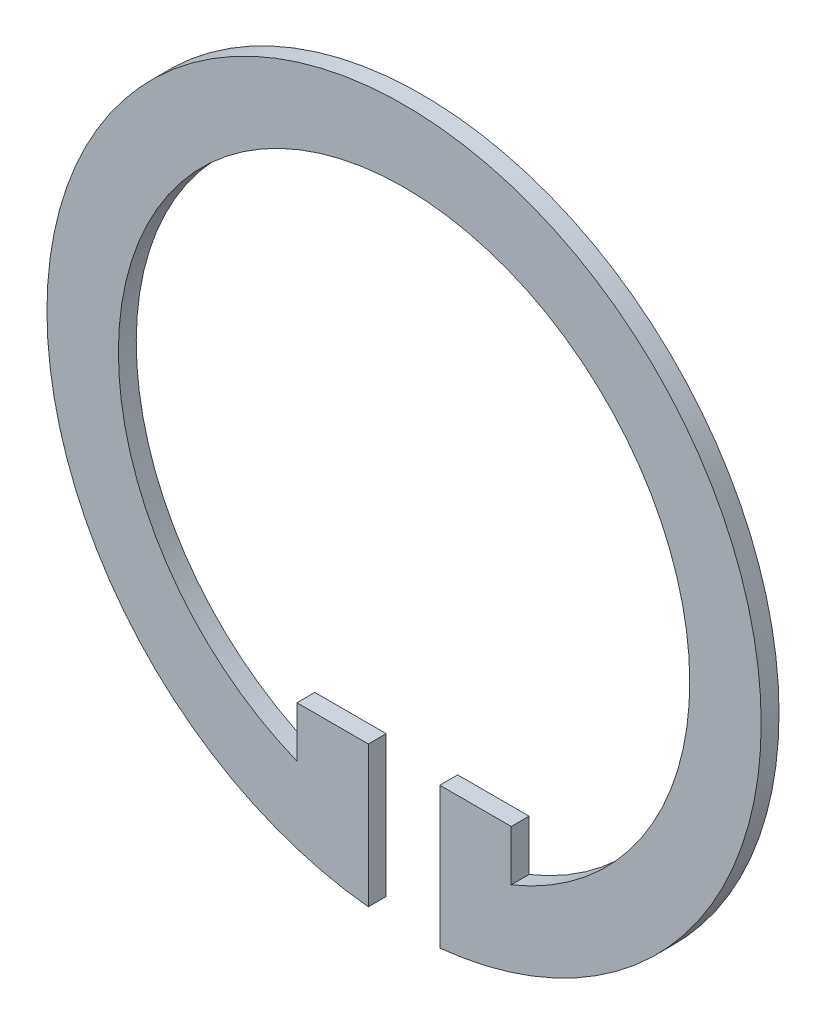
ISO-10303-21;
HEADER;
FILE_DESCRIPTION(('STEP AP214'),'2;1');
FILE_NAME('part.step','',(''),(''),'','','');
FILE_SCHEMA(('AUTOMOTIVE_DESIGN { 1 0 10303 214 1 1 1 1 }'));
ENDSEC;
DATA;
#1=APPLICATION_CONTEXT('core data for automotive mechanical design processes');
#2=APPLICATION_PROTOCOL_DEFINITION('international standard','automotive_design',2000,#1);
#3=PRODUCT_CONTEXT('',#1,'mechanical');
#4=PRODUCT('Part','Part','',(#3));
#5=PRODUCT_RELATED_PRODUCT_CATEGORY('part','',(#4));
#6=PRODUCT_DEFINITION_FORMATION('','',#4);
#7=PRODUCT_DEFINITION_CONTEXT('part definition',#1,'design');
#8=PRODUCT_DEFINITION('design','',#6,#7);
#9=PRODUCT_DEFINITION_SHAPE('','',#8);
#10=(LENGTH_UNIT() NAMED_UNIT(*) SI_UNIT(.MILLI.,.METRE.));
#11=(NAMED_UNIT(*) PLANE_ANGLE_UNIT() SI_UNIT($,.RADIAN.));
#12=(NAMED_UNIT(*) SI_UNIT($,.STERADIAN.) SOLID_ANGLE_UNIT());
#13=UNCERTAINTY_MEASURE_WITH_UNIT(LENGTH_MEASURE(1.E-05),#10,'distance_accuracy_value','');
#14=(GEOMETRIC_REPRESENTATION_CONTEXT(3) GLOBAL_UNCERTAINTY_ASSIGNED_CONTEXT((#13)) GLOBAL_UNIT_ASSIGNED_CONTEXT((#10,
#11,#12)) REPRESENTATION_CONTEXT('',''));
#15=CARTESIAN_POINT('',(0.,0.,0.));
#16=DIRECTION('',(0.,0.,1.));
#17=DIRECTION('',(1.,0.,0.));
#18=AXIS2_PLACEMENT_3D('',#15,#16,#17);
#19=CARTESIAN_POINT('',(-3.,-6.,0.5));
#20=DIRECTION('',(1.,0.,0.));
#21=DIRECTION('',(0.,0.,-1.));
#22=AXIS2_PLACEMENT_3D('',#19,#20,#21);
#23=PLANE('',#22);
#24=DIRECTION('',(0.,-1.,0.));
#25=VECTOR('',#24,1.);
#26=CARTESIAN_POINT('',(-3.,-6.,0.));
#27=LINE('',#26,#25);
#28=CARTESIAN_POINT('',(-3.,-6.,0.));
#29=VERTEX_POINT('',#28);
#30=CARTESIAN_POINT('',(-3.,-7.41619848709566,0.));
#31=VERTEX_POINT('',#30);
#32=EDGE_CURVE('E146',#29,#31,#27,.T.);
#33=ORIENTED_EDGE('',*,*,#32,.T.);
#34=DIRECTION('',(0.,0.,-1.));
#35=VECTOR('',#34,1.);
#36=CARTESIAN_POINT('',(-3.,-7.41619848709566,0.5));
#37=LINE('',#36,#35);
#38=CARTESIAN_POINT('',(-3.,-7.41619848709566,0.5));
#39=VERTEX_POINT('',#38);
#40=EDGE_CURVE('E11',#39,#31,#37,.T.);
#41=ORIENTED_EDGE('',*,*,#40,.F.);
#42=DIRECTION('',(0.,-1.,0.));
#43=VECTOR('',#42,1.);
#44=CARTESIAN_POINT('',(-3.,-6.,0.5));
#45=LINE('',#44,#43);
#46=CARTESIAN_POINT('',(-3.,-6.,0.5));
#47=VERTEX_POINT('',#46);
#48=EDGE_CURVE('E168',#47,#39,#45,.T.);
#49=ORIENTED_EDGE('',*,*,#48,.F.);
#50=DIRECTION('',(0.,0.,-1.));
#51=VECTOR('',#50,1.);
#52=CARTESIAN_POINT('',(-3.,-6.,0.5));
#53=LINE('',#52,#51);
#54=EDGE_CURVE('E142',#47,#29,#53,.T.);
#55=ORIENTED_EDGE('',*,*,#54,.T.);
#56=EDGE_LOOP('',(#33,#41,#49,#55));
#57=FACE_BOUND('',#56,.T.);
#58=ADVANCED_FACE('F45',(#57),#23,.F.);
#59=CARTESIAN_POINT('',(0.,0.,0.5));
#60=DIRECTION('',(0.,0.,-1.));
#61=DIRECTION('',(-1.,0.,0.));
#62=AXIS2_PLACEMENT_3D('',#59,#60,#61);
#63=CYLINDRICAL_SURFACE('',#62,8.);
#64=CARTESIAN_POINT('',(0.,0.,0.));
#65=DIRECTION('',(0.,0.,-1.));
#66=DIRECTION('',(-1.,0.,0.));
#67=AXIS2_PLACEMENT_3D('',#64,#65,#66);
#68=CIRCLE('',#67,8.);
#69=CARTESIAN_POINT('',(3.,-7.41619848709566,0.));
#70=VERTEX_POINT('',#69);
#71=EDGE_CURVE('E150',#31,#70,#68,.T.);
#72=ORIENTED_EDGE('',*,*,#71,.T.);
#73=DIRECTION('',(0.,0.,-1.));
#74=VECTOR('',#73,1.);
#75=CARTESIAN_POINT('',(3.,-7.41619848709566,0.5));
#76=LINE('',#75,#74);
#77=CARTESIAN_POINT('',(3.,-7.41619848709566,0.5));
#78=VERTEX_POINT('',#77);
#79=EDGE_CURVE('E54',#78,#70,#76,.T.);
#80=ORIENTED_EDGE('',*,*,#79,.F.);
#81=CARTESIAN_POINT('',(0.,0.,0.5));
#82=DIRECTION('',(0.,0.,-1.));
#83=DIRECTION('',(-1.,0.,0.));
#84=AXIS2_PLACEMENT_3D('',#81,#82,#83);
#85=CIRCLE('',#84,8.);
#86=EDGE_CURVE('E105',#39,#78,#85,.T.);
#87=ORIENTED_EDGE('',*,*,#86,.F.);
#88=ORIENTED_EDGE('',*,*,#40,.T.);
#89=EDGE_LOOP('',(#72,#80,#87,#88));
#90=FACE_BOUND('',#89,.T.);
#91=ADVANCED_FACE('F214',(#90),#63,.F.);
#92=CARTESIAN_POINT('',(3.,-6.,0.5));
#93=DIRECTION('',(-1.,0.,0.));
#94=DIRECTION('',(0.,0.,1.));
#95=AXIS2_PLACEMENT_3D('',#92,#93,#94);
#96=PLANE('',#95);
#97=DIRECTION('',(0.,1.,0.));
#98=VECTOR('',#97,1.);
#99=CARTESIAN_POINT('',(3.,-6.,0.));
#100=LINE('',#99,#98);
#101=CARTESIAN_POINT('',(3.,-6.,0.));
#102=VERTEX_POINT('',#101);
#103=EDGE_CURVE('E153',#70,#102,#100,.T.);
#104=ORIENTED_EDGE('',*,*,#103,.T.);
#105=DIRECTION('',(0.,0.,-1.));
#106=VECTOR('',#105,1.);
#107=CARTESIAN_POINT('',(3.,-6.,0.5));
#108=LINE('',#107,#106);
#109=CARTESIAN_POINT('',(3.,-6.,0.5));
#110=VERTEX_POINT('',#109);
#111=EDGE_CURVE('E179',#110,#102,#108,.T.);
#112=ORIENTED_EDGE('',*,*,#111,.F.);
#113=DIRECTION('',(0.,1.,0.));
#114=VECTOR('',#113,1.);
#115=CARTESIAN_POINT('',(3.,-6.,0.5));
#116=LINE('',#115,#114);
#117=EDGE_CURVE('E189',#78,#110,#116,.T.);
#118=ORIENTED_EDGE('',*,*,#117,.F.);
#119=ORIENTED_EDGE('',*,*,#79,.T.);
#120=EDGE_LOOP('',(#104,#112,#118,#119));
#121=FACE_BOUND('',#120,.T.);
#122=ADVANCED_FACE('F187',(#121),#96,.F.);
#123=CARTESIAN_POINT('',(1.,-6.,0.5));
#124=DIRECTION('',(0.,-1.,0.));
#125=DIRECTION('',(1.,0.,0.));
#126=AXIS2_PLACEMENT_3D('',#123,#124,#125);
#127=PLANE('',#126);
#128=DIRECTION('',(-1.,0.,0.));
#129=VECTOR('',#128,1.);
#130=CARTESIAN_POINT('',(1.,-6.,0.));
#131=LINE('',#130,#129);
#132=CARTESIAN_POINT('',(1.,-6.,0.));
#133=VERTEX_POINT('',#132);
#134=EDGE_CURVE('E156',#102,#133,#131,.T.);
#135=ORIENTED_EDGE('',*,*,#134,.T.);
#136=DIRECTION('',(0.,0.,-1.));
#137=VECTOR('',#136,1.);
#138=CARTESIAN_POINT('',(1.,-6.,0.5));
#139=LINE('',#138,#137);
#140=CARTESIAN_POINT('',(1.,-6.,0.5));
#141=VERTEX_POINT('',#140);
#142=EDGE_CURVE('E175',#141,#133,#139,.T.);
#143=ORIENTED_EDGE('',*,*,#142,.F.);
#144=DIRECTION('',(-1.,0.,0.));
#145=VECTOR('',#144,1.);
#146=CARTESIAN_POINT('',(1.,-6.,0.5));
#147=LINE('',#146,#145);
#148=EDGE_CURVE('E202',#110,#141,#147,.T.);
#149=ORIENTED_EDGE('',*,*,#148,.F.);
#150=ORIENTED_EDGE('',*,*,#111,.T.);
#151=EDGE_LOOP('',(#135,#143,#149,#150));
#152=FACE_BOUND('',#151,.T.);
#153=ADVANCED_FACE('F197',(#152),#127,.F.);
#154=CARTESIAN_POINT('',(1.,-6.,0.5));
#155=DIRECTION('',(1.,0.,0.));
#156=DIRECTION('',(0.,1.,0.));
#157=AXIS2_PLACEMENT_3D('',#154,#155,#156);
#158=PLANE('',#157);
#159=DIRECTION('',(0.,-1.,0.));
#160=VECTOR('',#159,1.);
#161=CARTESIAN_POINT('',(1.,-6.,0.));
#162=LINE('',#161,#160);
#163=CARTESIAN_POINT('',(1.,-9.9498743710662,0.));
#164=VERTEX_POINT('',#163);
#165=EDGE_CURVE('E159',#133,#164,#162,.T.);
#166=ORIENTED_EDGE('',*,*,#165,.T.);
#167=DIRECTION('',(0.,0.,-1.));
#168=VECTOR('',#167,1.);
#169=CARTESIAN_POINT('',(1.,-9.9498743710662,0.5));
#170=LINE('',#169,#168);
#171=CARTESIAN_POINT('',(1.,-9.9498743710662,0.5));
#172=VERTEX_POINT('',#171);
#173=EDGE_CURVE('E135',#172,#164,#170,.T.);
#174=ORIENTED_EDGE('',*,*,#173,.F.);
#175=DIRECTION('',(0.,-1.,0.));
#176=VECTOR('',#175,1.);
#177=CARTESIAN_POINT('',(1.,-6.,0.5));
#178=LINE('',#177,#176);
#179=EDGE_CURVE('E124',#141,#172,#178,.T.);
#180=ORIENTED_EDGE('',*,*,#179,.F.);
#181=ORIENTED_EDGE('',*,*,#142,.T.);
#182=EDGE_LOOP('',(#166,#174,#180,#181));
#183=FACE_BOUND('',#182,.T.);
#184=ADVANCED_FACE('F200',(#183),#158,.F.);
#185=CARTESIAN_POINT('',(0.,0.,0.5));
#186=DIRECTION('',(0.,0.,-1.));
#187=DIRECTION('',(-1.,0.,0.));
#188=AXIS2_PLACEMENT_3D('',#185,#186,#187);
#189=CYLINDRICAL_SURFACE('',#188,10.);
#190=CARTESIAN_POINT('',(0.,0.,0.));
#191=DIRECTION('',(0.,0.,1.));
#192=DIRECTION('',(-1.,0.,0.));
#193=AXIS2_PLACEMENT_3D('',#190,#191,#192);
#194=CIRCLE('',#193,10.);
#195=CARTESIAN_POINT('',(-0.999999999999999,-9.9498743710662,0.));
#196=VERTEX_POINT('',#195);
#197=EDGE_CURVE('E133',#164,#196,#194,.T.);
#198=ORIENTED_EDGE('',*,*,#197,.T.);
#199=DIRECTION('',(0.,0.,-1.));
#200=VECTOR('',#199,1.);
#201=CARTESIAN_POINT('',(-0.999999999999999,-9.9498743710662,0.5));
#202=LINE('',#201,#200);
#203=CARTESIAN_POINT('',(-0.999999999999999,-9.9498743710662,0.5));
#204=VERTEX_POINT('',#203);
#205=EDGE_CURVE('E130',#204,#196,#202,.T.);
#206=ORIENTED_EDGE('',*,*,#205,.F.);
#207=CARTESIAN_POINT('',(0.,0.,0.5));
#208=DIRECTION('',(0.,0.,1.));
#209=DIRECTION('',(-1.,0.,0.));
#210=AXIS2_PLACEMENT_3D('',#207,#208,#209);
#211=CIRCLE('',#210,10.);
#212=EDGE_CURVE('E118',#172,#204,#211,.T.);
#213=ORIENTED_EDGE('',*,*,#212,.F.);
#214=ORIENTED_EDGE('',*,*,#173,.T.);
#215=EDGE_LOOP('',(#198,#206,#213,#214));
#216=FACE_BOUND('',#215,.T.);
#217=ADVANCED_FACE('F131',(#216),#189,.T.);
#218=CARTESIAN_POINT('',(-0.999999999999999,-6.,0.5));
#219=DIRECTION('',(-1.,0.,0.));
#220=DIRECTION('',(0.,0.,1.));
#221=AXIS2_PLACEMENT_3D('',#218,#219,#220);
#222=PLANE('',#221);
#223=DIRECTION('',(0.,1.,0.));
#224=VECTOR('',#223,1.);
#225=CARTESIAN_POINT('',(-0.999999999999999,-6.,0.));
#226=LINE('',#225,#224);
#227=CARTESIAN_POINT('',(-0.999999999999999,-6.,0.));
#228=VERTEX_POINT('',#227);
#229=EDGE_CURVE('E91',#196,#228,#226,.T.);
#230=ORIENTED_EDGE('',*,*,#229,.T.);
#231=DIRECTION('',(0.,0.,-1.));
#232=VECTOR('',#231,1.);
#233=CARTESIAN_POINT('',(-0.999999999999999,-6.,0.5));
#234=LINE('',#233,#232);
#235=CARTESIAN_POINT('',(-0.999999999999999,-6.,0.5));
#236=VERTEX_POINT('',#235);
#237=EDGE_CURVE('E136',#236,#228,#234,.T.);
#238=ORIENTED_EDGE('',*,*,#237,.F.);
#239=DIRECTION('',(0.,1.,0.));
#240=VECTOR('',#239,1.);
#241=CARTESIAN_POINT('',(-0.999999999999999,-6.,0.5));
#242=LINE('',#241,#240);
#243=EDGE_CURVE('E122',#204,#236,#242,.T.);
#244=ORIENTED_EDGE('',*,*,#243,.F.);
#245=ORIENTED_EDGE('',*,*,#205,.T.);
#246=EDGE_LOOP('',(#230,#238,#244,#245));
#247=FACE_BOUND('',#246,.T.);
#248=ADVANCED_FACE('F138',(#247),#222,.F.);
#249=CARTESIAN_POINT('',(-3.,-6.,0.5));
#250=DIRECTION('',(0.,-1.,0.));
#251=DIRECTION('',(1.,0.,0.));
#252=AXIS2_PLACEMENT_3D('',#249,#250,#251);
#253=PLANE('',#252);
#254=DIRECTION('',(-1.,0.,0.));
#255=VECTOR('',#254,1.);
#256=CARTESIAN_POINT('',(-3.,-6.,0.));
#257=LINE('',#256,#255);
#258=EDGE_CURVE('E97',#228,#29,#257,.T.);
#259=ORIENTED_EDGE('',*,*,#258,.T.);
#260=ORIENTED_EDGE('',*,*,#54,.F.);
#261=DIRECTION('',(-1.,0.,0.));
#262=VECTOR('',#261,1.);
#263=CARTESIAN_POINT('',(-3.,-6.,0.5));
#264=LINE('',#263,#262);
#265=EDGE_CURVE('E62',#236,#47,#264,.T.);
#266=ORIENTED_EDGE('',*,*,#265,.F.);
#267=ORIENTED_EDGE('',*,*,#237,.T.);
#268=EDGE_LOOP('',(#259,#260,#266,#267));
#269=FACE_BOUND('',#268,.T.);
#270=ADVANCED_FACE('F230',(#269),#253,.F.);
#271=CARTESIAN_POINT('',(0.,0.,0.5));
#272=DIRECTION('',(0.,0.,-1.));
#273=DIRECTION('',(-1.,0.,0.));
#274=AXIS2_PLACEMENT_3D('',#271,#272,#273);
#275=PLANE('',#274);
#276=ORIENTED_EDGE('',*,*,#48,.T.);
#277=ORIENTED_EDGE('',*,*,#86,.T.);
#278=ORIENTED_EDGE('',*,*,#117,.T.);
#279=ORIENTED_EDGE('',*,*,#148,.T.);
#280=ORIENTED_EDGE('',*,*,#179,.T.);
#281=ORIENTED_EDGE('',*,*,#212,.T.);
#282=ORIENTED_EDGE('',*,*,#243,.T.);
#283=ORIENTED_EDGE('',*,*,#265,.T.);
#284=EDGE_LOOP('',(#276,#277,#278,#279,#280,#281,#282,#283));
#285=FACE_BOUND('',#284,.T.);
#286=ADVANCED_FACE('F120',(#285),#275,.F.);
#287=CARTESIAN_POINT('',(0.,0.,0.));
#288=DIRECTION('',(0.,0.,-1.));
#289=DIRECTION('',(-1.,0.,0.));
#290=AXIS2_PLACEMENT_3D('',#287,#288,#289);
#291=PLANE('',#290);
#292=ORIENTED_EDGE('',*,*,#32,.F.);
#293=ORIENTED_EDGE('',*,*,#258,.F.);
#294=ORIENTED_EDGE('',*,*,#229,.F.);
#295=ORIENTED_EDGE('',*,*,#197,.F.);
#296=ORIENTED_EDGE('',*,*,#165,.F.);
#297=ORIENTED_EDGE('',*,*,#134,.F.);
#298=ORIENTED_EDGE('',*,*,#103,.F.);
#299=ORIENTED_EDGE('',*,*,#71,.F.);
#300=EDGE_LOOP('',(#292,#293,#294,#295,#296,#297,#298,#299));
#301=FACE_BOUND('',#300,.T.);
#302=ADVANCED_FACE('F193',(#301),#291,.T.);
#303=CLOSED_SHELL('',(#58,#91,#122,#153,#184,#217,#248,#270,#286,#302));
#304=MANIFOLD_SOLID_BREP('B2',#303);
#305=ADVANCED_BREP_SHAPE_REPRESENTATION('',(#18,#304),#14);
#306=SHAPE_DEFINITION_REPRESENTATION(#9,#305);
ENDSEC;
END-ISO-10303-21;
